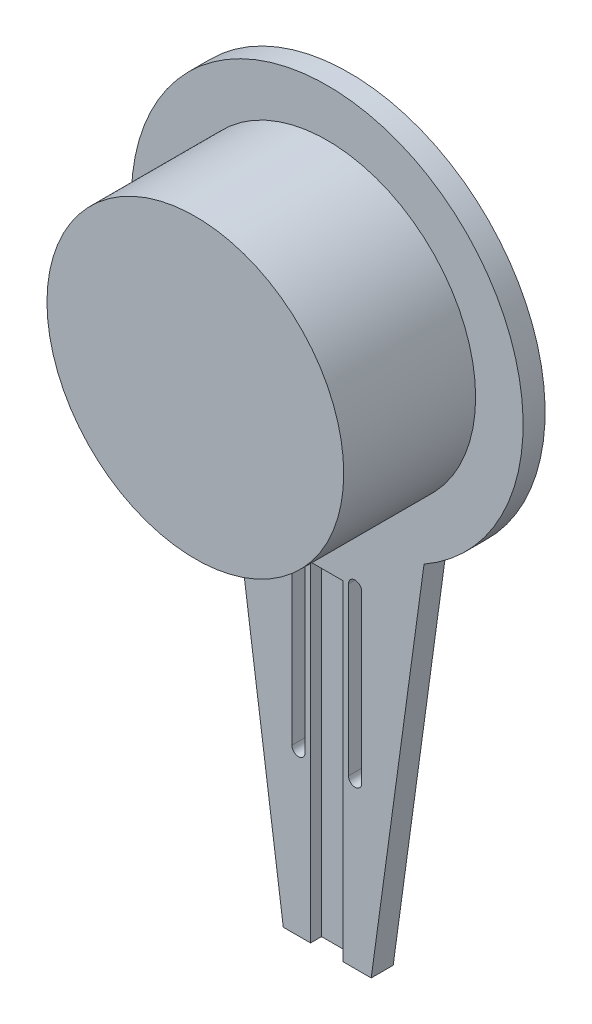
ISO-10303-21;
HEADER;
FILE_DESCRIPTION(('STEP AP214'),'2;1');
FILE_NAME('part.step','',(''),(''),'','','');
FILE_SCHEMA(('AUTOMOTIVE_DESIGN { 1 0 10303 214 1 1 1 1 }'));
ENDSEC;
DATA;
#1=APPLICATION_CONTEXT('core data for automotive mechanical design processes');
#2=APPLICATION_PROTOCOL_DEFINITION('international standard','automotive_design',2000,#1);
#3=PRODUCT_CONTEXT('',#1,'mechanical');
#4=PRODUCT('Part','Part','',(#3));
#5=PRODUCT_RELATED_PRODUCT_CATEGORY('part','',(#4));
#6=PRODUCT_DEFINITION_FORMATION('','',#4);
#7=PRODUCT_DEFINITION_CONTEXT('part definition',#1,'design');
#8=PRODUCT_DEFINITION('design','',#6,#7);
#9=PRODUCT_DEFINITION_SHAPE('','',#8);
#10=(LENGTH_UNIT() NAMED_UNIT(*) SI_UNIT(.MILLI.,.METRE.));
#11=(NAMED_UNIT(*) PLANE_ANGLE_UNIT() SI_UNIT($,.RADIAN.));
#12=(NAMED_UNIT(*) SI_UNIT($,.STERADIAN.) SOLID_ANGLE_UNIT());
#13=UNCERTAINTY_MEASURE_WITH_UNIT(LENGTH_MEASURE(1.E-05),#10,'distance_accuracy_value','');
#14=(GEOMETRIC_REPRESENTATION_CONTEXT(3) GLOBAL_UNCERTAINTY_ASSIGNED_CONTEXT((#13)) GLOBAL_UNIT_ASSIGNED_CONTEXT((#10,
#11,#12)) REPRESENTATION_CONTEXT('',''));
#15=CARTESIAN_POINT('',(0.,0.,0.));
#16=DIRECTION('',(0.,0.,1.));
#17=DIRECTION('',(1.,0.,0.));
#18=AXIS2_PLACEMENT_3D('',#15,#16,#17);
#19=CARTESIAN_POINT('',(-8.76622298026837,-15.5117789239385,5.08));
#20=DIRECTION('',(0.990710151265788,-0.135990426791443,0.));
#21=DIRECTION('',(0.135990426791443,0.990710151265788,0.));
#22=AXIS2_PLACEMENT_3D('',#19,#20,#21);
#23=PLANE('',#22);
#24=DIRECTION('',(-0.135990426791443,-0.990710151265788,0.));
#25=VECTOR('',#24,1.);
#26=CARTESIAN_POINT('',(-8.76622298026837,-15.5117789239385,0.));
#27=LINE('',#26,#25);
#28=CARTESIAN_POINT('',(-8.76622298026839,-15.5117789239386,0.));
#29=VERTEX_POINT('',#28);
#30=CARTESIAN_POINT('',(-20.975152411205,-104.455615697584,0.));
#31=VERTEX_POINT('',#30);
#32=EDGE_CURVE('E237',#29,#31,#27,.T.);
#33=ORIENTED_EDGE('',*,*,#32,.F.);
#34=DIRECTION('',(0.,0.,-1.));
#35=VECTOR('',#34,1.);
#36=CARTESIAN_POINT('',(-8.76622298026839,-15.5117789239386,5.08));
#37=LINE('',#36,#35);
#38=CARTESIAN_POINT('',(-8.76622298026839,-15.5117789239386,5.08));
#39=VERTEX_POINT('',#38);
#40=EDGE_CURVE('E40',#39,#29,#37,.T.);
#41=ORIENTED_EDGE('',*,*,#40,.F.);
#42=DIRECTION('',(-0.135990426791443,-0.990710151265788,0.));
#43=VECTOR('',#42,1.);
#44=CARTESIAN_POINT('',(-8.76622298026837,-15.5117789239385,5.08));
#45=LINE('',#44,#43);
#46=CARTESIAN_POINT('',(-20.975152411205,-104.455615697584,5.08));
#47=VERTEX_POINT('',#46);
#48=EDGE_CURVE('E245',#39,#47,#45,.T.);
#49=ORIENTED_EDGE('',*,*,#48,.T.);
#50=DIRECTION('',(0.,0.,-1.));
#51=VECTOR('',#50,1.);
#52=CARTESIAN_POINT('',(-20.975152411205,-104.455615697584,5.08));
#53=LINE('',#52,#51);
#54=EDGE_CURVE('E35',#47,#31,#53,.T.);
#55=ORIENTED_EDGE('',*,*,#54,.T.);
#56=EDGE_LOOP('',(#33,#41,#49,#55));
#57=FACE_BOUND('',#56,.T.);
#58=ADVANCED_FACE('F32',(#57),#23,.T.);
#59=CARTESIAN_POINT('',(-31.135152411205,23.8450745161991,5.08));
#60=DIRECTION('',(0.,0.,-1.));
#61=DIRECTION('',(-1.,0.,0.));
#62=AXIS2_PLACEMENT_3D('',#59,#60,#61);
#63=CYLINDRICAL_SURFACE('',#62,45.2695362975444);
#64=CARTESIAN_POINT('',(-31.135152411205,23.8450745161991,0.));
#65=DIRECTION('',(0.,0.,1.));
#66=DIRECTION('',(1.,0.,0.));
#67=AXIS2_PLACEMENT_3D('',#64,#65,#66);
#68=CIRCLE('',#67,45.2695362975444);
#69=CARTESIAN_POINT('',(-53.5040818421417,-15.5117789239385,0.));
#70=VERTEX_POINT('',#69);
#71=EDGE_CURVE('E249',#29,#70,#68,.T.);
#72=ORIENTED_EDGE('',*,*,#71,.T.);
#73=DIRECTION('',(0.,0.,-1.));
#74=VECTOR('',#73,1.);
#75=CARTESIAN_POINT('',(-53.5040818421417,-15.5117789239385,5.08));
#76=LINE('',#75,#74);
#77=CARTESIAN_POINT('',(-53.5040818421417,-15.5117789239385,5.08));
#78=VERTEX_POINT('',#77);
#79=EDGE_CURVE('E268',#78,#70,#76,.T.);
#80=ORIENTED_EDGE('',*,*,#79,.F.);
#81=CARTESIAN_POINT('',(-31.135152411205,23.8450745161991,5.08));
#82=DIRECTION('',(0.,0.,1.));
#83=DIRECTION('',(1.,0.,0.));
#84=AXIS2_PLACEMENT_3D('',#81,#82,#83);
#85=CIRCLE('',#84,45.2695362975444);
#86=EDGE_CURVE('E256',#39,#78,#85,.T.);
#87=ORIENTED_EDGE('',*,*,#86,.F.);
#88=ORIENTED_EDGE('',*,*,#40,.T.);
#89=EDGE_LOOP('',(#72,#80,#87,#88));
#90=FACE_BOUND('',#89,.T.);
#91=ADVANCED_FACE('F284',(#90),#63,.T.);
#92=CARTESIAN_POINT('',(-53.5040818421417,-15.5117789239385,5.08));
#93=DIRECTION('',(0.990710151265788,0.135990426791444,0.));
#94=DIRECTION('',(-0.135990426791444,0.990710151265788,0.));
#95=AXIS2_PLACEMENT_3D('',#92,#93,#94);
#96=PLANE('',#95);
#97=DIRECTION('',(0.135990426791444,-0.990710151265788,0.));
#98=VECTOR('',#97,1.);
#99=CARTESIAN_POINT('',(-53.5040818421417,-15.5117789239385,0.));
#100=LINE('',#99,#98);
#101=CARTESIAN_POINT('',(-41.295152411205,-104.455615697584,0.));
#102=VERTEX_POINT('',#101);
#103=EDGE_CURVE('E263',#70,#102,#100,.T.);
#104=ORIENTED_EDGE('',*,*,#103,.T.);
#105=DIRECTION('',(0.,0.,-1.));
#106=VECTOR('',#105,1.);
#107=CARTESIAN_POINT('',(-41.295152411205,-104.455615697584,5.08));
#108=LINE('',#107,#106);
#109=CARTESIAN_POINT('',(-41.295152411205,-104.455615697584,5.08));
#110=VERTEX_POINT('',#109);
#111=EDGE_CURVE('E270',#110,#102,#108,.T.);
#112=ORIENTED_EDGE('',*,*,#111,.F.);
#113=DIRECTION('',(0.135990426791444,-0.990710151265788,0.));
#114=VECTOR('',#113,1.);
#115=CARTESIAN_POINT('',(-53.5040818421417,-15.5117789239385,5.08));
#116=LINE('',#115,#114);
#117=EDGE_CURVE('E253',#78,#110,#116,.T.);
#118=ORIENTED_EDGE('',*,*,#117,.F.);
#119=ORIENTED_EDGE('',*,*,#79,.T.);
#120=EDGE_LOOP('',(#104,#112,#118,#119));
#121=FACE_BOUND('',#120,.T.);
#122=ADVANCED_FACE('F288',(#121),#96,.F.);
#123=CARTESIAN_POINT('',(-36.215152411205,-104.455615697584,5.08));
#124=DIRECTION('',(0.,-1.,0.));
#125=DIRECTION('',(0.,0.,-1.));
#126=AXIS2_PLACEMENT_3D('',#123,#124,#125);
#127=PLANE('',#126);
#128=DIRECTION('',(0.,0.,1.));
#129=VECTOR('',#128,1.);
#130=CARTESIAN_POINT('',(-27.4955437183637,-104.455615697584,2.54));
#131=LINE('',#130,#129);
#132=CARTESIAN_POINT('',(-27.4955437183637,-104.455615697584,2.54));
#133=VERTEX_POINT('',#132);
#134=CARTESIAN_POINT('',(-27.4955437183637,-104.455615697584,5.08));
#135=VERTEX_POINT('',#134);
#136=EDGE_CURVE('E235',#133,#135,#131,.T.);
#137=ORIENTED_EDGE('',*,*,#136,.F.);
#138=DIRECTION('',(1.,0.,0.));
#139=VECTOR('',#138,1.);
#140=CARTESIAN_POINT('',(-34.992699225592,-104.455615697584,2.54));
#141=LINE('',#140,#139);
#142=CARTESIAN_POINT('',(-34.992699225592,-104.455615697584,2.54));
#143=VERTEX_POINT('',#142);
#144=EDGE_CURVE('E225',#143,#133,#141,.T.);
#145=ORIENTED_EDGE('',*,*,#144,.F.);
#146=DIRECTION('',(0.,0.,1.));
#147=VECTOR('',#146,1.);
#148=CARTESIAN_POINT('',(-34.992699225592,-104.455615697584,2.54));
#149=LINE('',#148,#147);
#150=CARTESIAN_POINT('',(-34.992699225592,-104.455615697584,5.08));
#151=VERTEX_POINT('',#150);
#152=EDGE_CURVE('E238',#143,#151,#149,.T.);
#153=ORIENTED_EDGE('',*,*,#152,.T.);
#154=DIRECTION('',(1.,0.,0.));
#155=VECTOR('',#154,1.);
#156=CARTESIAN_POINT('',(-26.055152411205,-104.455615697584,5.08));
#157=LINE('',#156,#155);
#158=EDGE_CURVE('E250',#110,#151,#157,.T.);
#159=ORIENTED_EDGE('',*,*,#158,.F.);
#160=ORIENTED_EDGE('',*,*,#111,.T.);
#161=DIRECTION('',(-1.,0.,0.));
#162=VECTOR('',#161,1.);
#163=CARTESIAN_POINT('',(-36.215152411205,-104.455615697584,0.));
#164=LINE('',#163,#162);
#165=EDGE_CURVE('E260',#31,#102,#164,.T.);
#166=ORIENTED_EDGE('',*,*,#165,.F.);
#167=ORIENTED_EDGE('',*,*,#54,.F.);
#168=EDGE_CURVE('E248',#135,#47,#157,.T.);
#169=ORIENTED_EDGE('',*,*,#168,.F.);
#170=EDGE_LOOP('',(#137,#145,#153,#159,#160,#166,#167,#169));
#171=FACE_BOUND('',#170,.T.);
#172=ADVANCED_FACE('F294',(#171),#127,.T.);
#173=CARTESIAN_POINT('',(-31.135152411205,23.8450745161991,5.08));
#174=DIRECTION('',(0.,0.,1.));
#175=DIRECTION('',(1.,0.,0.));
#176=AXIS2_PLACEMENT_3D('',#173,#174,#175);
#177=PLANE('',#176);
#178=CARTESIAN_POINT('',(-31.135152411205,23.8450745161991,5.08));
#179=DIRECTION('',(0.,0.,1.));
#180=DIRECTION('',(1.,0.,0.));
#181=AXIS2_PLACEMENT_3D('',#178,#179,#180);
#182=CIRCLE('',#181,34.29);
#183=CARTESIAN_POINT('',(-65.425152411205,23.8450745161991,5.08));
#184=VERTEX_POINT('',#183);
#185=EDGE_CURVE('E11',#184,#184,#182,.T.);
#186=ORIENTED_EDGE('',*,*,#185,.F.);
#187=EDGE_LOOP('',(#186));
#188=FACE_BOUND('',#187,.T.);
#189=CARTESIAN_POINT('',(-37.786699225592,-28.2048006073907,5.08));
#190=DIRECTION('',(0.,0.,1.));
#191=DIRECTION('',(1.,0.,0.));
#192=AXIS2_PLACEMENT_3D('',#189,#190,#191);
#193=CIRCLE('',#192,1.524);
#194=CARTESIAN_POINT('',(-36.262699225592,-28.2048006073907,5.08));
#195=VERTEX_POINT('',#194);
#196=CARTESIAN_POINT('',(-39.310699225592,-28.2048006073907,5.08));
#197=VERTEX_POINT('',#196);
#198=EDGE_CURVE('E48',#195,#197,#193,.T.);
#199=ORIENTED_EDGE('',*,*,#198,.F.);
#200=DIRECTION('',(0.,-1.,0.));
#201=VECTOR('',#200,1.);
#202=CARTESIAN_POINT('',(-36.262699225592,-28.2048006073907,5.08));
#203=LINE('',#202,#201);
#204=CARTESIAN_POINT('',(-36.262699225592,-67.0406092215643,5.08));
#205=VERTEX_POINT('',#204);
#206=EDGE_CURVE('E166',#195,#205,#203,.T.);
#207=ORIENTED_EDGE('',*,*,#206,.T.);
#208=CARTESIAN_POINT('',(-37.786699225592,-67.0406092215643,5.08));
#209=DIRECTION('',(0.,0.,1.));
#210=DIRECTION('',(1.,0.,0.));
#211=AXIS2_PLACEMENT_3D('',#208,#209,#210);
#212=CIRCLE('',#211,1.524);
#213=CARTESIAN_POINT('',(-39.310699225592,-67.0406092215643,5.08));
#214=VERTEX_POINT('',#213);
#215=EDGE_CURVE('E169',#214,#205,#212,.T.);
#216=ORIENTED_EDGE('',*,*,#215,.F.);
#217=DIRECTION('',(0.,-1.,0.));
#218=VECTOR('',#217,1.);
#219=CARTESIAN_POINT('',(-39.310699225592,-28.2048006073907,5.08));
#220=LINE('',#219,#218);
#221=EDGE_CURVE('E176',#197,#214,#220,.T.);
#222=ORIENTED_EDGE('',*,*,#221,.F.);
#223=EDGE_LOOP('',(#199,#207,#216,#222));
#224=FACE_BOUND('',#223,.T.);
#225=CARTESIAN_POINT('',(-24.7015437183637,-28.2048006073907,5.08));
#226=DIRECTION('',(0.,0.,1.));
#227=DIRECTION('',(1.,0.,0.));
#228=AXIS2_PLACEMENT_3D('',#225,#226,#227);
#229=CIRCLE('',#228,1.524);
#230=CARTESIAN_POINT('',(-23.1775437183637,-28.2048006073907,5.08));
#231=VERTEX_POINT('',#230);
#232=CARTESIAN_POINT('',(-26.2255437183637,-28.2048006073907,5.08));
#233=VERTEX_POINT('',#232);
#234=EDGE_CURVE('E56',#231,#233,#229,.T.);
#235=ORIENTED_EDGE('',*,*,#234,.F.);
#236=DIRECTION('',(0.,-1.,0.));
#237=VECTOR('',#236,1.);
#238=CARTESIAN_POINT('',(-23.1775437183637,-28.2048006073907,5.08));
#239=LINE('',#238,#237);
#240=CARTESIAN_POINT('',(-23.1775437183637,-66.6169527934812,5.08));
#241=VERTEX_POINT('',#240);
#242=EDGE_CURVE('E196',#231,#241,#239,.T.);
#243=ORIENTED_EDGE('',*,*,#242,.T.);
#244=CARTESIAN_POINT('',(-24.7015437183637,-66.6169527934812,5.08));
#245=DIRECTION('',(0.,0.,1.));
#246=DIRECTION('',(1.,0.,0.));
#247=AXIS2_PLACEMENT_3D('',#244,#245,#246);
#248=CIRCLE('',#247,1.524);
#249=CARTESIAN_POINT('',(-26.2255437183637,-66.6169527934812,5.08));
#250=VERTEX_POINT('',#249);
#251=EDGE_CURVE('E199',#250,#241,#248,.T.);
#252=ORIENTED_EDGE('',*,*,#251,.F.);
#253=DIRECTION('',(0.,-1.,0.));
#254=VECTOR('',#253,1.);
#255=CARTESIAN_POINT('',(-26.2255437183637,-28.2048006073907,5.08));
#256=LINE('',#255,#254);
#257=EDGE_CURVE('E203',#233,#250,#256,.T.);
#258=ORIENTED_EDGE('',*,*,#257,.F.);
#259=EDGE_LOOP('',(#235,#243,#252,#258));
#260=FACE_BOUND('',#259,.T.);
#261=DIRECTION('',(0.,1.,0.));
#262=VECTOR('',#261,1.);
#263=CARTESIAN_POINT('',(-27.4955437183637,-104.455615697584,5.08));
#264=LINE('',#263,#262);
#265=CARTESIAN_POINT('',(-27.4955437183637,-28.2048006073907,5.08));
#266=VERTEX_POINT('',#265);
#267=EDGE_CURVE('E182',#135,#266,#264,.T.);
#268=ORIENTED_EDGE('',*,*,#267,.F.);
#269=ORIENTED_EDGE('',*,*,#168,.T.);
#270=ORIENTED_EDGE('',*,*,#48,.F.);
#271=ORIENTED_EDGE('',*,*,#86,.T.);
#272=ORIENTED_EDGE('',*,*,#117,.T.);
#273=ORIENTED_EDGE('',*,*,#158,.T.);
#274=DIRECTION('',(0.,1.,0.));
#275=VECTOR('',#274,1.);
#276=CARTESIAN_POINT('',(-34.992699225592,-104.455615697584,5.08));
#277=LINE('',#276,#275);
#278=CARTESIAN_POINT('',(-34.992699225592,-28.2048006073907,5.08));
#279=VERTEX_POINT('',#278);
#280=EDGE_CURVE('E220',#151,#279,#277,.T.);
#281=ORIENTED_EDGE('',*,*,#280,.T.);
#282=DIRECTION('',(-1.,0.,0.));
#283=VECTOR('',#282,1.);
#284=CARTESIAN_POINT('',(-27.4955437183637,-28.2048006073907,5.08));
#285=LINE('',#284,#283);
#286=EDGE_CURVE('E230',#266,#279,#285,.T.);
#287=ORIENTED_EDGE('',*,*,#286,.F.);
#288=EDGE_LOOP('',(#268,#269,#270,#271,#272,#273,#281,#287));
#289=FACE_BOUND('',#288,.T.);
#290=ADVANCED_FACE('F291',(#188,#224,#260,#289),#177,.T.);
#291=CARTESIAN_POINT('',(-31.135152411205,23.8450745161991,0.));
#292=DIRECTION('',(0.,0.,1.));
#293=DIRECTION('',(1.,0.,0.));
#294=AXIS2_PLACEMENT_3D('',#291,#292,#293);
#295=PLANE('',#294);
#296=DIRECTION('',(0.,-1.,0.));
#297=VECTOR('',#296,1.);
#298=CARTESIAN_POINT('',(-36.262699225592,-28.2048006073907,0.));
#299=LINE('',#298,#297);
#300=CARTESIAN_POINT('',(-36.262699225592,-28.2048006073907,0.));
#301=VERTEX_POINT('',#300);
#302=CARTESIAN_POINT('',(-36.262699225592,-67.0406092215643,0.));
#303=VERTEX_POINT('',#302);
#304=EDGE_CURVE('E154',#301,#303,#299,.T.);
#305=ORIENTED_EDGE('',*,*,#304,.F.);
#306=CARTESIAN_POINT('',(-37.786699225592,-28.2048006073907,0.));
#307=DIRECTION('',(0.,0.,1.));
#308=DIRECTION('',(1.,0.,0.));
#309=AXIS2_PLACEMENT_3D('',#306,#307,#308);
#310=CIRCLE('',#309,1.524);
#311=CARTESIAN_POINT('',(-39.310699225592,-28.2048006073907,0.));
#312=VERTEX_POINT('',#311);
#313=EDGE_CURVE('E148',#301,#312,#310,.T.);
#314=ORIENTED_EDGE('',*,*,#313,.T.);
#315=DIRECTION('',(0.,-1.,0.));
#316=VECTOR('',#315,1.);
#317=CARTESIAN_POINT('',(-39.310699225592,-28.2048006073907,0.));
#318=LINE('',#317,#316);
#319=CARTESIAN_POINT('',(-39.310699225592,-67.0406092215643,0.));
#320=VERTEX_POINT('',#319);
#321=EDGE_CURVE('E158',#312,#320,#318,.T.);
#322=ORIENTED_EDGE('',*,*,#321,.T.);
#323=CARTESIAN_POINT('',(-37.786699225592,-67.0406092215643,0.));
#324=DIRECTION('',(0.,0.,1.));
#325=DIRECTION('',(1.,0.,0.));
#326=AXIS2_PLACEMENT_3D('',#323,#324,#325);
#327=CIRCLE('',#326,1.524);
#328=EDGE_CURVE('E162',#320,#303,#327,.T.);
#329=ORIENTED_EDGE('',*,*,#328,.T.);
#330=EDGE_LOOP('',(#305,#314,#322,#329));
#331=FACE_BOUND('',#330,.T.);
#332=DIRECTION('',(0.,-1.,0.));
#333=VECTOR('',#332,1.);
#334=CARTESIAN_POINT('',(-23.1775437183637,-28.2048006073907,0.));
#335=LINE('',#334,#333);
#336=CARTESIAN_POINT('',(-23.1775437183637,-28.2048006073907,0.));
#337=VERTEX_POINT('',#336);
#338=CARTESIAN_POINT('',(-23.1775437183637,-66.6169527934812,0.));
#339=VERTEX_POINT('',#338);
#340=EDGE_CURVE('E188',#337,#339,#335,.T.);
#341=ORIENTED_EDGE('',*,*,#340,.F.);
#342=CARTESIAN_POINT('',(-24.7015437183637,-28.2048006073907,0.));
#343=DIRECTION('',(0.,0.,1.));
#344=DIRECTION('',(1.,0.,0.));
#345=AXIS2_PLACEMENT_3D('',#342,#343,#344);
#346=CIRCLE('',#345,1.524);
#347=CARTESIAN_POINT('',(-26.2255437183637,-28.2048006073907,0.));
#348=VERTEX_POINT('',#347);
#349=EDGE_CURVE('E200',#337,#348,#346,.T.);
#350=ORIENTED_EDGE('',*,*,#349,.T.);
#351=DIRECTION('',(0.,-1.,0.));
#352=VECTOR('',#351,1.);
#353=CARTESIAN_POINT('',(-26.2255437183637,-28.2048006073907,0.));
#354=LINE('',#353,#352);
#355=CARTESIAN_POINT('',(-26.2255437183637,-66.6169527934812,0.));
#356=VERTEX_POINT('',#355);
#357=EDGE_CURVE('E211',#348,#356,#354,.T.);
#358=ORIENTED_EDGE('',*,*,#357,.T.);
#359=CARTESIAN_POINT('',(-24.7015437183637,-66.6169527934812,0.));
#360=DIRECTION('',(0.,0.,1.));
#361=DIRECTION('',(1.,0.,0.));
#362=AXIS2_PLACEMENT_3D('',#359,#360,#361);
#363=CIRCLE('',#362,1.524);
#364=EDGE_CURVE('E208',#356,#339,#363,.T.);
#365=ORIENTED_EDGE('',*,*,#364,.T.);
#366=EDGE_LOOP('',(#341,#350,#358,#365));
#367=FACE_BOUND('',#366,.T.);
#368=ORIENTED_EDGE('',*,*,#32,.T.);
#369=ORIENTED_EDGE('',*,*,#165,.T.);
#370=ORIENTED_EDGE('',*,*,#103,.F.);
#371=ORIENTED_EDGE('',*,*,#71,.F.);
#372=EDGE_LOOP('',(#368,#369,#370,#371));
#373=FACE_BOUND('',#372,.T.);
#374=ADVANCED_FACE('F164',(#331,#367,#373),#295,.F.);
#375=CARTESIAN_POINT('',(-27.4955437183637,-104.455615697584,2.54));
#376=DIRECTION('',(1.,0.,0.));
#377=DIRECTION('',(0.,0.,-1.));
#378=AXIS2_PLACEMENT_3D('',#375,#376,#377);
#379=PLANE('',#378);
#380=ORIENTED_EDGE('',*,*,#267,.T.);
#381=DIRECTION('',(0.,0.,1.));
#382=VECTOR('',#381,1.);
#383=CARTESIAN_POINT('',(-27.4955437183637,-28.2048006073907,2.54));
#384=LINE('',#383,#382);
#385=CARTESIAN_POINT('',(-27.4955437183637,-28.2048006073907,2.54));
#386=VERTEX_POINT('',#385);
#387=EDGE_CURVE('E228',#386,#266,#384,.T.);
#388=ORIENTED_EDGE('',*,*,#387,.F.);
#389=DIRECTION('',(0.,1.,0.));
#390=VECTOR('',#389,1.);
#391=CARTESIAN_POINT('',(-27.4955437183637,-104.455615697584,2.54));
#392=LINE('',#391,#390);
#393=EDGE_CURVE('E216',#133,#386,#392,.T.);
#394=ORIENTED_EDGE('',*,*,#393,.F.);
#395=ORIENTED_EDGE('',*,*,#136,.T.);
#396=EDGE_LOOP('',(#380,#388,#394,#395));
#397=FACE_BOUND('',#396,.T.);
#398=ADVANCED_FACE('F297',(#397),#379,.F.);
#399=CARTESIAN_POINT('',(-34.992699225592,-104.455615697584,2.54));
#400=DIRECTION('',(1.,0.,0.));
#401=DIRECTION('',(0.,0.,-1.));
#402=AXIS2_PLACEMENT_3D('',#399,#400,#401);
#403=PLANE('',#402);
#404=ORIENTED_EDGE('',*,*,#280,.F.);
#405=ORIENTED_EDGE('',*,*,#152,.F.);
#406=DIRECTION('',(0.,1.,0.));
#407=VECTOR('',#406,1.);
#408=CARTESIAN_POINT('',(-34.992699225592,-104.455615697584,2.54));
#409=LINE('',#408,#407);
#410=CARTESIAN_POINT('',(-34.992699225592,-28.2048006073907,2.54));
#411=VERTEX_POINT('',#410);
#412=EDGE_CURVE('E223',#143,#411,#409,.T.);
#413=ORIENTED_EDGE('',*,*,#412,.T.);
#414=DIRECTION('',(0.,0.,1.));
#415=VECTOR('',#414,1.);
#416=CARTESIAN_POINT('',(-34.992699225592,-28.2048006073907,2.54));
#417=LINE('',#416,#415);
#418=EDGE_CURVE('E241',#411,#279,#417,.T.);
#419=ORIENTED_EDGE('',*,*,#418,.T.);
#420=EDGE_LOOP('',(#404,#405,#413,#419));
#421=FACE_BOUND('',#420,.T.);
#422=ADVANCED_FACE('F304',(#421),#403,.T.);
#423=CARTESIAN_POINT('',(-27.4955437183637,-28.2048006073907,2.54));
#424=DIRECTION('',(0.,1.,0.));
#425=DIRECTION('',(0.,0.,1.));
#426=AXIS2_PLACEMENT_3D('',#423,#424,#425);
#427=PLANE('',#426);
#428=ORIENTED_EDGE('',*,*,#286,.T.);
#429=ORIENTED_EDGE('',*,*,#418,.F.);
#430=DIRECTION('',(-1.,0.,0.));
#431=VECTOR('',#430,1.);
#432=CARTESIAN_POINT('',(-27.4955437183637,-28.2048006073907,2.54));
#433=LINE('',#432,#431);
#434=EDGE_CURVE('E219',#386,#411,#433,.T.);
#435=ORIENTED_EDGE('',*,*,#434,.F.);
#436=ORIENTED_EDGE('',*,*,#387,.T.);
#437=EDGE_LOOP('',(#428,#429,#435,#436));
#438=FACE_BOUND('',#437,.T.);
#439=ADVANCED_FACE('F306',(#438),#427,.F.);
#440=CARTESIAN_POINT('',(0.,0.,2.54));
#441=DIRECTION('',(0.,0.,1.));
#442=DIRECTION('',(1.,0.,0.));
#443=AXIS2_PLACEMENT_3D('',#440,#441,#442);
#444=PLANE('',#443);
#445=ORIENTED_EDGE('',*,*,#393,.T.);
#446=ORIENTED_EDGE('',*,*,#434,.T.);
#447=ORIENTED_EDGE('',*,*,#412,.F.);
#448=ORIENTED_EDGE('',*,*,#144,.T.);
#449=EDGE_LOOP('',(#445,#446,#447,#448));
#450=FACE_BOUND('',#449,.T.);
#451=ADVANCED_FACE('F301',(#450),#444,.T.);
#452=CARTESIAN_POINT('',(-24.7015437183637,-28.2048006073907,0.));
#453=DIRECTION('',(0.,0.,1.));
#454=DIRECTION('',(1.,0.,0.));
#455=AXIS2_PLACEMENT_3D('',#452,#453,#454);
#456=CYLINDRICAL_SURFACE('',#455,1.524);
#457=ORIENTED_EDGE('',*,*,#234,.T.);
#458=DIRECTION('',(0.,0.,1.));
#459=VECTOR('',#458,1.);
#460=CARTESIAN_POINT('',(-26.2255437183637,-28.2048006073907,0.));
#461=LINE('',#460,#459);
#462=EDGE_CURVE('E186',#348,#233,#461,.T.);
#463=ORIENTED_EDGE('',*,*,#462,.F.);
#464=ORIENTED_EDGE('',*,*,#349,.F.);
#465=DIRECTION('',(0.,0.,1.));
#466=VECTOR('',#465,1.);
#467=CARTESIAN_POINT('',(-23.1775437183637,-28.2048006073907,0.));
#468=LINE('',#467,#466);
#469=EDGE_CURVE('E193',#337,#231,#468,.T.);
#470=ORIENTED_EDGE('',*,*,#469,.T.);
#471=EDGE_LOOP('',(#457,#463,#464,#470));
#472=FACE_BOUND('',#471,.T.);
#473=ADVANCED_FACE('F313',(#472),#456,.F.);
#474=CARTESIAN_POINT('',(-23.1775437183637,-28.2048006073907,0.));
#475=DIRECTION('',(-1.,0.,0.));
#476=DIRECTION('',(0.,-1.,0.));
#477=AXIS2_PLACEMENT_3D('',#474,#475,#476);
#478=PLANE('',#477);
#479=ORIENTED_EDGE('',*,*,#242,.F.);
#480=ORIENTED_EDGE('',*,*,#469,.F.);
#481=ORIENTED_EDGE('',*,*,#340,.T.);
#482=DIRECTION('',(0.,0.,1.));
#483=VECTOR('',#482,1.);
#484=CARTESIAN_POINT('',(-23.1775437183637,-66.6169527934812,0.));
#485=LINE('',#484,#483);
#486=EDGE_CURVE('E191',#339,#241,#485,.T.);
#487=ORIENTED_EDGE('',*,*,#486,.T.);
#488=EDGE_LOOP('',(#479,#480,#481,#487));
#489=FACE_BOUND('',#488,.T.);
#490=ADVANCED_FACE('F371',(#489),#478,.T.);
#491=CARTESIAN_POINT('',(-24.7015437183637,-66.6169527934812,0.));
#492=DIRECTION('',(0.,0.,1.));
#493=DIRECTION('',(1.,0.,0.));
#494=AXIS2_PLACEMENT_3D('',#491,#492,#493);
#495=CYLINDRICAL_SURFACE('',#494,1.524);
#496=ORIENTED_EDGE('',*,*,#251,.T.);
#497=ORIENTED_EDGE('',*,*,#486,.F.);
#498=ORIENTED_EDGE('',*,*,#364,.F.);
#499=DIRECTION('',(0.,0.,1.));
#500=VECTOR('',#499,1.);
#501=CARTESIAN_POINT('',(-26.2255437183637,-66.6169527934812,0.));
#502=LINE('',#501,#500);
#503=EDGE_CURVE('E189',#356,#250,#502,.T.);
#504=ORIENTED_EDGE('',*,*,#503,.T.);
#505=EDGE_LOOP('',(#496,#497,#498,#504));
#506=FACE_BOUND('',#505,.T.);
#507=ADVANCED_FACE('F380',(#506),#495,.F.);
#508=CARTESIAN_POINT('',(-26.2255437183637,-28.2048006073907,0.));
#509=DIRECTION('',(-1.,0.,0.));
#510=DIRECTION('',(0.,-1.,0.));
#511=AXIS2_PLACEMENT_3D('',#508,#509,#510);
#512=PLANE('',#511);
#513=ORIENTED_EDGE('',*,*,#257,.T.);
#514=ORIENTED_EDGE('',*,*,#503,.F.);
#515=ORIENTED_EDGE('',*,*,#357,.F.);
#516=ORIENTED_EDGE('',*,*,#462,.T.);
#517=EDGE_LOOP('',(#513,#514,#515,#516));
#518=FACE_BOUND('',#517,.T.);
#519=ADVANCED_FACE('F390',(#518),#512,.F.);
#520=CARTESIAN_POINT('',(-37.786699225592,-28.2048006073907,0.));
#521=DIRECTION('',(0.,0.,1.));
#522=DIRECTION('',(1.,0.,0.));
#523=AXIS2_PLACEMENT_3D('',#520,#521,#522);
#524=CYLINDRICAL_SURFACE('',#523,1.524);
#525=ORIENTED_EDGE('',*,*,#198,.T.);
#526=DIRECTION('',(0.,0.,1.));
#527=VECTOR('',#526,1.);
#528=CARTESIAN_POINT('',(-39.310699225592,-28.2048006073907,0.));
#529=LINE('',#528,#527);
#530=EDGE_CURVE('E144',#312,#197,#529,.T.);
#531=ORIENTED_EDGE('',*,*,#530,.F.);
#532=ORIENTED_EDGE('',*,*,#313,.F.);
#533=DIRECTION('',(0.,0.,1.));
#534=VECTOR('',#533,1.);
#535=CARTESIAN_POINT('',(-36.262699225592,-28.2048006073907,0.));
#536=LINE('',#535,#534);
#537=EDGE_CURVE('E180',#301,#195,#536,.T.);
#538=ORIENTED_EDGE('',*,*,#537,.T.);
#539=EDGE_LOOP('',(#525,#531,#532,#538));
#540=FACE_BOUND('',#539,.T.);
#541=ADVANCED_FACE('F146',(#540),#524,.F.);
#542=CARTESIAN_POINT('',(-36.262699225592,-28.2048006073907,0.));
#543=DIRECTION('',(-1.,0.,0.));
#544=DIRECTION('',(0.,-1.,0.));
#545=AXIS2_PLACEMENT_3D('',#542,#543,#544);
#546=PLANE('',#545);
#547=ORIENTED_EDGE('',*,*,#206,.F.);
#548=ORIENTED_EDGE('',*,*,#537,.F.);
#549=ORIENTED_EDGE('',*,*,#304,.T.);
#550=DIRECTION('',(0.,0.,1.));
#551=VECTOR('',#550,1.);
#552=CARTESIAN_POINT('',(-36.262699225592,-67.0406092215643,0.));
#553=LINE('',#552,#551);
#554=EDGE_CURVE('E183',#303,#205,#553,.T.);
#555=ORIENTED_EDGE('',*,*,#554,.T.);
#556=EDGE_LOOP('',(#547,#548,#549,#555));
#557=FACE_BOUND('',#556,.T.);
#558=ADVANCED_FACE('F409',(#557),#546,.T.);
#559=CARTESIAN_POINT('',(-37.786699225592,-67.0406092215643,0.));
#560=DIRECTION('',(0.,0.,1.));
#561=DIRECTION('',(1.,0.,0.));
#562=AXIS2_PLACEMENT_3D('',#559,#560,#561);
#563=CYLINDRICAL_SURFACE('',#562,1.524);
#564=ORIENTED_EDGE('',*,*,#215,.T.);
#565=ORIENTED_EDGE('',*,*,#554,.F.);
#566=ORIENTED_EDGE('',*,*,#328,.F.);
#567=DIRECTION('',(0.,0.,1.));
#568=VECTOR('',#567,1.);
#569=CARTESIAN_POINT('',(-39.310699225592,-67.0406092215643,0.));
#570=LINE('',#569,#568);
#571=EDGE_CURVE('E153',#320,#214,#570,.T.);
#572=ORIENTED_EDGE('',*,*,#571,.T.);
#573=EDGE_LOOP('',(#564,#565,#566,#572));
#574=FACE_BOUND('',#573,.T.);
#575=ADVANCED_FACE('F418',(#574),#563,.F.);
#576=CARTESIAN_POINT('',(-39.310699225592,-28.2048006073907,0.));
#577=DIRECTION('',(-1.,0.,0.));
#578=DIRECTION('',(0.,0.,1.));
#579=AXIS2_PLACEMENT_3D('',#576,#577,#578);
#580=PLANE('',#579);
#581=ORIENTED_EDGE('',*,*,#221,.T.);
#582=ORIENTED_EDGE('',*,*,#571,.F.);
#583=ORIENTED_EDGE('',*,*,#321,.F.);
#584=ORIENTED_EDGE('',*,*,#530,.T.);
#585=EDGE_LOOP('',(#581,#582,#583,#584));
#586=FACE_BOUND('',#585,.T.);
#587=ADVANCED_FACE('F159',(#586),#580,.F.);
#588=CARTESIAN_POINT('',(-31.135152411205,23.8450745161991,35.56));
#589=DIRECTION('',(0.,0.,-1.));
#590=DIRECTION('',(-1.,0.,0.));
#591=AXIS2_PLACEMENT_3D('',#588,#589,#590);
#592=CYLINDRICAL_SURFACE('',#591,34.29);
#593=CARTESIAN_POINT('',(-31.135152411205,23.8450745161991,35.56));
#594=DIRECTION('',(0.,0.,1.));
#595=DIRECTION('',(1.,0.,0.));
#596=AXIS2_PLACEMENT_3D('',#593,#594,#595);
#597=CIRCLE('',#596,34.29);
#598=CARTESIAN_POINT('',(-65.425152411205,23.8450745161991,35.56));
#599=VERTEX_POINT('',#598);
#600=EDGE_CURVE('E195',#599,#599,#597,.T.);
#601=CARTESIAN_POINT('',(-65.425152411205,23.8450745161991,35.56));
#602=CARTESIAN_POINT('',(-65.425152411205,23.8450745161991,35.2425));
#603=CARTESIAN_POINT('',(-65.425152411205,23.8450745161991,34.925));
#604=CARTESIAN_POINT('',(-65.425152411205,23.8450745161991,34.29));
#605=CARTESIAN_POINT('',(-65.425152411205,23.8450745161991,33.9725));
#606=CARTESIAN_POINT('',(-65.425152411205,23.8450745161991,33.3375));
#607=CARTESIAN_POINT('',(-65.425152411205,23.8450745161991,33.02));
#608=CARTESIAN_POINT('',(-65.425152411205,23.8450745161991,32.385));
#609=CARTESIAN_POINT('',(-65.425152411205,23.8450745161991,32.0675));
#610=CARTESIAN_POINT('',(-65.425152411205,23.8450745161991,31.4325));
#611=CARTESIAN_POINT('',(-65.425152411205,23.8450745161991,31.115));
#612=CARTESIAN_POINT('',(-65.425152411205,23.8450745161991,30.48));
#613=CARTESIAN_POINT('',(-65.425152411205,23.8450745161991,30.1625));
#614=CARTESIAN_POINT('',(-65.425152411205,23.8450745161991,29.5275));
#615=CARTESIAN_POINT('',(-65.425152411205,23.8450745161991,29.21));
#616=CARTESIAN_POINT('',(-65.425152411205,23.8450745161991,28.575));
#617=CARTESIAN_POINT('',(-65.425152411205,23.8450745161991,28.2575));
#618=CARTESIAN_POINT('',(-65.425152411205,23.8450745161991,27.6225));
#619=CARTESIAN_POINT('',(-65.425152411205,23.8450745161991,27.305));
#620=CARTESIAN_POINT('',(-65.425152411205,23.8450745161991,26.67));
#621=CARTESIAN_POINT('',(-65.425152411205,23.8450745161991,26.3525));
#622=CARTESIAN_POINT('',(-65.425152411205,23.8450745161991,25.7175));
#623=CARTESIAN_POINT('',(-65.425152411205,23.8450745161991,25.4));
#624=CARTESIAN_POINT('',(-65.425152411205,23.8450745161991,24.765));
#625=CARTESIAN_POINT('',(-65.425152411205,23.8450745161991,24.4475));
#626=CARTESIAN_POINT('',(-65.425152411205,23.8450745161991,23.8125));
#627=CARTESIAN_POINT('',(-65.425152411205,23.8450745161991,23.495));
#628=CARTESIAN_POINT('',(-65.425152411205,23.8450745161991,22.86));
#629=CARTESIAN_POINT('',(-65.425152411205,23.8450745161991,22.5425));
#630=CARTESIAN_POINT('',(-65.425152411205,23.8450745161991,21.9075));
#631=CARTESIAN_POINT('',(-65.425152411205,23.8450745161991,21.59));
#632=CARTESIAN_POINT('',(-65.425152411205,23.8450745161991,20.955));
#633=CARTESIAN_POINT('',(-65.425152411205,23.8450745161991,20.6375));
#634=CARTESIAN_POINT('',(-65.425152411205,23.8450745161991,20.0025));
#635=CARTESIAN_POINT('',(-65.425152411205,23.8450745161991,19.685));
#636=CARTESIAN_POINT('',(-65.425152411205,23.8450745161991,19.05));
#637=CARTESIAN_POINT('',(-65.425152411205,23.8450745161991,18.7325));
#638=CARTESIAN_POINT('',(-65.425152411205,23.8450745161991,18.0975));
#639=CARTESIAN_POINT('',(-65.425152411205,23.8450745161991,17.78));
#640=CARTESIAN_POINT('',(-65.425152411205,23.8450745161991,17.145));
#641=CARTESIAN_POINT('',(-65.425152411205,23.8450745161991,16.8275));
#642=CARTESIAN_POINT('',(-65.425152411205,23.8450745161991,16.1925));
#643=CARTESIAN_POINT('',(-65.425152411205,23.8450745161991,15.875));
#644=CARTESIAN_POINT('',(-65.425152411205,23.8450745161991,15.24));
#645=CARTESIAN_POINT('',(-65.425152411205,23.8450745161991,14.9225));
#646=CARTESIAN_POINT('',(-65.425152411205,23.8450745161991,14.2875));
#647=CARTESIAN_POINT('',(-65.425152411205,23.8450745161991,13.97));
#648=CARTESIAN_POINT('',(-65.425152411205,23.8450745161991,13.335));
#649=CARTESIAN_POINT('',(-65.425152411205,23.8450745161991,13.0175));
#650=CARTESIAN_POINT('',(-65.425152411205,23.8450745161991,12.3825));
#651=CARTESIAN_POINT('',(-65.425152411205,23.8450745161991,12.065));
#652=CARTESIAN_POINT('',(-65.425152411205,23.8450745161991,11.43));
#653=CARTESIAN_POINT('',(-65.425152411205,23.8450745161991,11.1125));
#654=CARTESIAN_POINT('',(-65.425152411205,23.8450745161991,10.4775));
#655=CARTESIAN_POINT('',(-65.425152411205,23.8450745161991,10.16));
#656=CARTESIAN_POINT('',(-65.425152411205,23.8450745161991,9.525));
#657=CARTESIAN_POINT('',(-65.425152411205,23.8450745161991,9.2075));
#658=CARTESIAN_POINT('',(-65.425152411205,23.8450745161991,8.5725));
#659=CARTESIAN_POINT('',(-65.425152411205,23.8450745161991,8.255));
#660=CARTESIAN_POINT('',(-65.425152411205,23.8450745161991,7.62));
#661=CARTESIAN_POINT('',(-65.425152411205,23.8450745161991,7.3025));
#662=CARTESIAN_POINT('',(-65.425152411205,23.8450745161991,6.6675));
#663=CARTESIAN_POINT('',(-65.425152411205,23.8450745161991,6.35));
#664=CARTESIAN_POINT('',(-65.425152411205,23.8450745161991,5.715));
#665=CARTESIAN_POINT('',(-65.425152411205,23.8450745161991,5.3975));
#666=CARTESIAN_POINT('',(-65.425152411205,23.8450745161991,5.08));
#667=B_SPLINE_CURVE_WITH_KNOTS('',3,(#601,#602,#603,#604,#605,#606,#607,#608,#609,#610,#611,
#612,#613,#614,#615,#616,#617,#618,#619,#620,#621,#622,#623,#624,#625,#626,#627,#628,#629,#630,
#631,#632,#633,#634,#635,#636,#637,#638,#639,#640,#641,#642,#643,#644,#645,#646,#647,#648,#649,
#650,#651,#652,#653,#654,#655,#656,#657,#658,#659,#660,#661,#662,#663,#664,#665,#666),
.UNSPECIFIED.,.F.,.F.,(4,2,2,2,2,2,2,2,2,2,2,2,2,2,2,2,2,2,2,2,2,2,2,2,2,2,2,2,2,2,2,2,4),(0.,
0.952499999999995,1.905,2.8575,3.80999999999999,4.7625,5.715,6.6675,7.61999999999999,8.5725,
9.525,10.4775,11.43,12.3825,13.335,14.2875,15.24,16.1925,17.145,18.0975,19.05,20.0025,20.955,
21.9075,22.86,23.8125,24.765,25.7175,26.67,27.6225,28.575,29.5275,30.48),.UNSPECIFIED.);
#668=EDGE_CURVE('BSEAM436',#599,#184,#667,.T.);
#669=ORIENTED_EDGE('',*,*,#600,.F.);
#670=ORIENTED_EDGE('',*,*,#185,.T.);
#671=ORIENTED_EDGE('',*,*,#668,.T.);
#672=ORIENTED_EDGE('',*,*,#668,.F.);
#673=EDGE_LOOP('',(#669,#671,#670,#672));
#674=FACE_BOUND('',#673,.T.);
#675=ADVANCED_FACE('F436',(#674),#592,.T.);
#676=CARTESIAN_POINT('',(-31.135152411205,23.8450745161991,35.56));
#677=DIRECTION('',(0.,0.,1.));
#678=DIRECTION('',(1.,0.,0.));
#679=AXIS2_PLACEMENT_3D('',#676,#677,#678);
#680=PLANE('',#679);
#681=ORIENTED_EDGE('',*,*,#600,.T.);
#682=EDGE_LOOP('',(#681));
#683=FACE_BOUND('',#682,.T.);
#684=ADVANCED_FACE('F450',(#683),#680,.T.);
#685=CLOSED_SHELL('',(#58,#91,#122,#172,#290,#374,#398,#422,#439,#451,#473,#490,#507,#519,#541,
#558,#575,#587,#675,#684));
#686=MANIFOLD_SOLID_BREP('B2',#685);
#687=ADVANCED_BREP_SHAPE_REPRESENTATION('',(#18,#686),#14);
#688=SHAPE_DEFINITION_REPRESENTATION(#9,#687);
ENDSEC;
END-ISO-10303-21;
